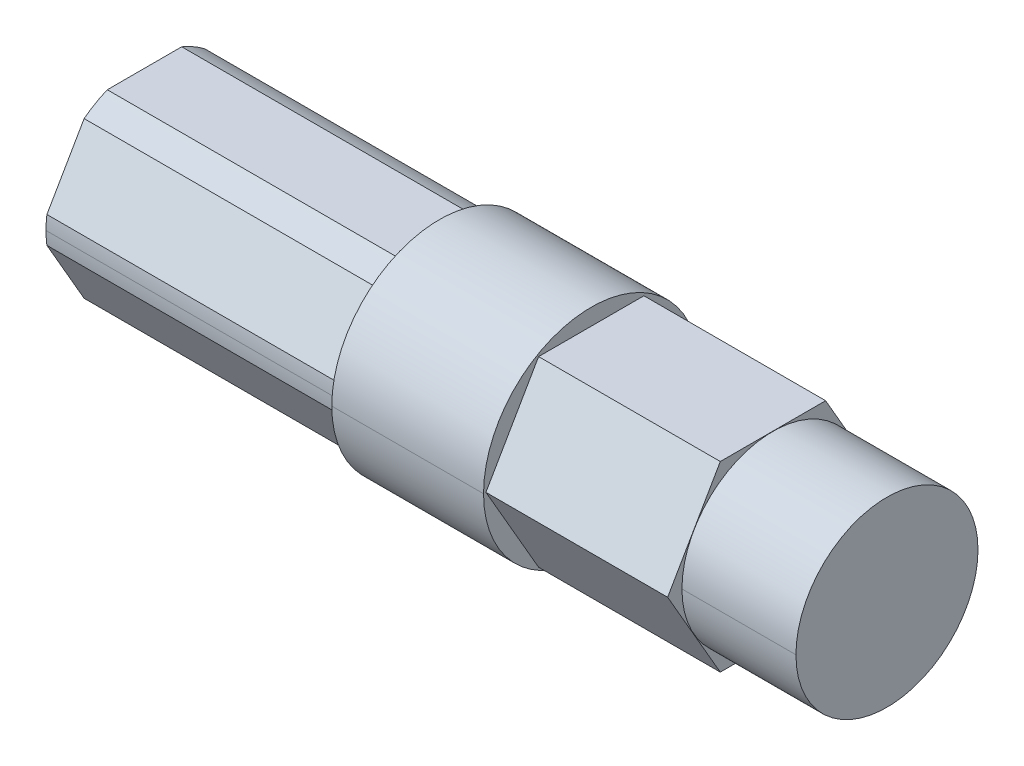
ISO-10303-21;
HEADER;
FILE_DESCRIPTION(('STEP AP214'),'2;1');
FILE_NAME('part.step','',(''),(''),'','','');
FILE_SCHEMA(('AUTOMOTIVE_DESIGN { 1 0 10303 214 1 1 1 1 }'));
ENDSEC;
DATA;
#1=APPLICATION_CONTEXT('core data for automotive mechanical design processes');
#2=APPLICATION_PROTOCOL_DEFINITION('international standard','automotive_design',2000,#1);
#3=PRODUCT_CONTEXT('',#1,'mechanical');
#4=PRODUCT('Part','Part','',(#3));
#5=PRODUCT_RELATED_PRODUCT_CATEGORY('part','',(#4));
#6=PRODUCT_DEFINITION_FORMATION('','',#4);
#7=PRODUCT_DEFINITION_CONTEXT('part definition',#1,'design');
#8=PRODUCT_DEFINITION('design','',#6,#7);
#9=PRODUCT_DEFINITION_SHAPE('','',#8);
#10=(LENGTH_UNIT() NAMED_UNIT(*) SI_UNIT(.MILLI.,.METRE.));
#11=(NAMED_UNIT(*) PLANE_ANGLE_UNIT() SI_UNIT($,.RADIAN.));
#12=(NAMED_UNIT(*) SI_UNIT($,.STERADIAN.) SOLID_ANGLE_UNIT());
#13=UNCERTAINTY_MEASURE_WITH_UNIT(LENGTH_MEASURE(1.E-05),#10,'distance_accuracy_value','');
#14=(GEOMETRIC_REPRESENTATION_CONTEXT(3) GLOBAL_UNCERTAINTY_ASSIGNED_CONTEXT((#13)) GLOBAL_UNIT_ASSIGNED_CONTEXT((#10,
#11,#12)) REPRESENTATION_CONTEXT('',''));
#15=CARTESIAN_POINT('',(0.,0.,0.));
#16=DIRECTION('',(0.,0.,1.));
#17=DIRECTION('',(1.,0.,0.));
#18=AXIS2_PLACEMENT_3D('',#15,#16,#17);
#19=CARTESIAN_POINT('',(-21.8757499999997,0.,0.));
#20=DIRECTION('',(-1.,0.,0.));
#21=DIRECTION('',(0.,0.,1.));
#22=AXIS2_PLACEMENT_3D('',#19,#20,#21);
#23=CYLINDRICAL_SURFACE('',#22,2.01929999999992);
#24=DIRECTION('',(-1.,0.,0.));
#25=VECTOR('',#24,1.);
#26=CARTESIAN_POINT('',(-21.8757499999997,0.,-2.01929999999992));
#27=LINE('',#26,#25);
#28=CARTESIAN_POINT('',(-6.00074999999972,0.,-2.01929999999992));
#29=VERTEX_POINT('',#28);
#30=CARTESIAN_POINT('',(-21.8757499999997,0.,-2.0193));
#31=VERTEX_POINT('',#30);
#32=EDGE_CURVE('E372',#29,#31,#27,.T.);
#33=ORIENTED_EDGE('',*,*,#32,.F.);
#34=CARTESIAN_POINT('',(-6.00074999999972,0.,0.));
#35=DIRECTION('',(-1.,0.,0.));
#36=DIRECTION('',(0.,0.,1.));
#37=AXIS2_PLACEMENT_3D('',#34,#35,#36);
#38=CIRCLE('',#37,2.01929999999992);
#39=CARTESIAN_POINT('',(-6.00074999999972,0.,2.01929999999992));
#40=VERTEX_POINT('',#39);
#41=EDGE_CURVE('E11',#40,#29,#38,.T.);
#42=ORIENTED_EDGE('',*,*,#41,.F.);
#43=DIRECTION('',(-1.,0.,0.));
#44=VECTOR('',#43,1.);
#45=CARTESIAN_POINT('',(-21.8757499999997,0.,2.01929999999992));
#46=LINE('',#45,#44);
#47=CARTESIAN_POINT('',(-21.8757499999997,0.,2.01929999999992));
#48=VERTEX_POINT('',#47);
#49=EDGE_CURVE('E301',#40,#48,#46,.T.);
#50=ORIENTED_EDGE('',*,*,#49,.T.);
#51=CARTESIAN_POINT('',(-21.8757499999997,0.,0.));
#52=DIRECTION('',(-1.,0.,0.));
#53=DIRECTION('',(0.,0.,1.));
#54=AXIS2_PLACEMENT_3D('',#51,#52,#53);
#55=CIRCLE('',#54,2.01929999999992);
#56=EDGE_CURVE('E272',#48,#31,#55,.T.);
#57=ORIENTED_EDGE('',*,*,#56,.T.);
#58=EDGE_LOOP('',(#33,#42,#50,#57));
#59=FACE_BOUND('',#58,.T.);
#60=ADVANCED_FACE('F17',(#59),#23,.F.);
#61=CARTESIAN_POINT('',(-6.00074999999972,0.,0.));
#62=DIRECTION('',(-1.,0.,0.));
#63=DIRECTION('',(0.,0.,1.));
#64=AXIS2_PLACEMENT_3D('',#61,#62,#63);
#65=CONICAL_SURFACE('',#64,2.01929999999992,1.02974425867665);
#66=DIRECTION('',(-0.515038074910058,0.,-0.85716730070211));
#67=VECTOR('',#66,1.);
#68=CARTESIAN_POINT('',(-6.00074999999972,0.,-2.01929999999992));
#69=LINE('',#68,#67);
#70=CARTESIAN_POINT('',(-4.78743215199737,0.,0.));
#71=VERTEX_POINT('',#70);
#72=EDGE_CURVE('E350',#71,#29,#69,.T.);
#73=ORIENTED_EDGE('',*,*,#72,.F.);
#74=DIRECTION('',(-0.515038074910058,0.,0.85716730070211));
#75=VECTOR('',#74,1.);
#76=CARTESIAN_POINT('',(-6.00074999999972,0.,2.01929999999992));
#77=LINE('',#76,#75);
#78=EDGE_CURVE('E305',#71,#40,#77,.T.);
#79=ORIENTED_EDGE('',*,*,#78,.T.);
#80=ORIENTED_EDGE('',*,*,#41,.T.);
#81=EDGE_LOOP('',(#73,#79,#80));
#82=FACE_BOUND('',#81,.T.);
#83=ADVANCED_FACE('F644',(#82),#65,.F.);
#84=CARTESIAN_POINT('',(30.5440110921291,0.,0.));
#85=DIRECTION('',(-1.,0.,0.));
#86=DIRECTION('',(0.,0.,1.));
#87=AXIS2_PLACEMENT_3D('',#84,#85,#86);
#88=CYLINDRICAL_SURFACE('',#87,6.85799999999974);
#89=DIRECTION('',(1.,0.,0.));
#90=VECTOR('',#89,1.);
#91=CARTESIAN_POINT('',(30.5440110921291,-6.34999999999993,2.59030191290503));
#92=LINE('',#91,#90);
#93=CARTESIAN_POINT('',(-21.8757499999997,-6.34999999999988,2.59030191290501));
#94=VERTEX_POINT('',#93);
#95=CARTESIAN_POINT('',(-1.33985,-6.34999999999993,2.590301912905));
#96=VERTEX_POINT('',#95);
#97=EDGE_CURVE('E332',#94,#96,#92,.T.);
#98=ORIENTED_EDGE('',*,*,#97,.T.);
#99=CARTESIAN_POINT('',(-1.33985,0.,0.));
#100=DIRECTION('',(-1.,0.,0.));
#101=DIRECTION('',(0.,0.,-1.));
#102=AXIS2_PLACEMENT_3D('',#99,#100,#101);
#103=CIRCLE('',#102,6.85799999999974);
#104=CARTESIAN_POINT('',(-1.33985,-5.41826726004725,4.20411035757835));
#105=VERTEX_POINT('',#104);
#106=EDGE_CURVE('E147',#96,#105,#103,.T.);
#107=ORIENTED_EDGE('',*,*,#106,.T.);
#108=DIRECTION('',(-1.,0.,0.));
#109=VECTOR('',#108,1.);
#110=CARTESIAN_POINT('',(30.5440110921291,-5.41826726004726,4.20411035757844));
#111=LINE('',#110,#109);
#112=CARTESIAN_POINT('',(-21.8757499999997,-5.41826726004722,4.20411035757841));
#113=VERTEX_POINT('',#112);
#114=EDGE_CURVE('E328',#105,#113,#111,.T.);
#115=ORIENTED_EDGE('',*,*,#114,.T.);
#116=CARTESIAN_POINT('',(-21.8757499999997,0.,0.));
#117=DIRECTION('',(-1.,0.,0.));
#118=DIRECTION('',(0.,0.,1.));
#119=AXIS2_PLACEMENT_3D('',#116,#117,#118);
#120=CIRCLE('',#119,6.85799999999974);
#121=EDGE_CURVE('E324',#94,#113,#120,.T.);
#122=ORIENTED_EDGE('',*,*,#121,.F.);
#123=EDGE_LOOP('',(#98,#107,#115,#122));
#124=FACE_BOUND('',#123,.T.);
#125=ADVANCED_FACE('F650',(#124),#88,.T.);
#126=CARTESIAN_POINT('',(30.5440110921291,0.,0.));
#127=DIRECTION('',(-1.,0.,0.));
#128=DIRECTION('',(0.,0.,1.));
#129=AXIS2_PLACEMENT_3D('',#126,#127,#128);
#130=CYLINDRICAL_SURFACE('',#129,6.85799999999974);
#131=DIRECTION('',(-1.,0.,0.));
#132=VECTOR('',#131,1.);
#133=CARTESIAN_POINT('',(30.5440110921291,0.,6.85799999999974));
#134=LINE('',#133,#132);
#135=CARTESIAN_POINT('',(-1.33985,0.,6.858));
#136=VERTEX_POINT('',#135);
#137=CARTESIAN_POINT('',(-21.8757499999997,0.,6.858));
#138=VERTEX_POINT('',#137);
#139=EDGE_CURVE('E504',#136,#138,#134,.T.);
#140=ORIENTED_EDGE('',*,*,#139,.F.);
#141=CARTESIAN_POINT('',(-1.33985,0.,0.));
#142=DIRECTION('',(-1.,0.,0.));
#143=DIRECTION('',(0.,1.93484117616543E-13,-1.));
#144=AXIS2_PLACEMENT_3D('',#141,#142,#143);
#145=CIRCLE('',#144,6.85799999999974);
#146=CARTESIAN_POINT('',(-1.33985,0.93173273995268,6.79441227048352));
#147=VERTEX_POINT('',#146);
#148=EDGE_CURVE('E385',#136,#147,#145,.T.);
#149=ORIENTED_EDGE('',*,*,#148,.T.);
#150=DIRECTION('',(-1.,0.,0.));
#151=VECTOR('',#150,1.);
#152=CARTESIAN_POINT('',(30.5440110921291,0.931732739952683,6.79441227048351));
#153=LINE('',#152,#151);
#154=CARTESIAN_POINT('',(-21.8757499999997,0.931732739952685,6.79441227048351));
#155=VERTEX_POINT('',#154);
#156=EDGE_CURVE('E357',#147,#155,#153,.T.);
#157=ORIENTED_EDGE('',*,*,#156,.T.);
#158=CARTESIAN_POINT('',(-21.8757499999997,0.,0.));
#159=DIRECTION('',(-1.,0.,0.));
#160=DIRECTION('',(0.,0.,1.));
#161=AXIS2_PLACEMENT_3D('',#158,#159,#160);
#162=CIRCLE('',#161,6.85799999999974);
#163=EDGE_CURVE('E296',#138,#155,#162,.T.);
#164=ORIENTED_EDGE('',*,*,#163,.F.);
#165=EDGE_LOOP('',(#140,#149,#157,#164));
#166=FACE_BOUND('',#165,.T.);
#167=ADVANCED_FACE('F574',(#166),#130,.T.);
#168=CARTESIAN_POINT('',(30.5440110921291,0.,0.));
#169=DIRECTION('',(-1.,0.,0.));
#170=DIRECTION('',(0.,0.,1.));
#171=AXIS2_PLACEMENT_3D('',#168,#169,#170);
#172=CYLINDRICAL_SURFACE('',#171,6.85799999999974);
#173=DIRECTION('',(1.,0.,0.));
#174=VECTOR('',#173,1.);
#175=CARTESIAN_POINT('',(30.5440110921291,5.41826726004728,4.20411035757846));
#176=LINE('',#175,#174);
#177=CARTESIAN_POINT('',(-21.8757499999997,5.41826726004728,4.20411035757846));
#178=VERTEX_POINT('',#177);
#179=CARTESIAN_POINT('',(-1.33985,5.41826726004728,4.20411035757842));
#180=VERTEX_POINT('',#179);
#181=EDGE_CURVE('E403',#178,#180,#176,.T.);
#182=ORIENTED_EDGE('',*,*,#181,.T.);
#183=CARTESIAN_POINT('',(-1.33985,0.,0.));
#184=DIRECTION('',(-1.,0.,0.));
#185=DIRECTION('',(0.,-1.68892677621096E-13,-1.));
#186=AXIS2_PLACEMENT_3D('',#183,#184,#185);
#187=CIRCLE('',#186,6.85799999999974);
#188=CARTESIAN_POINT('',(-1.33985,6.35,2.59030191290503));
#189=VERTEX_POINT('',#188);
#190=EDGE_CURVE('E370',#180,#189,#187,.T.);
#191=ORIENTED_EDGE('',*,*,#190,.T.);
#192=DIRECTION('',(-1.,0.,0.));
#193=VECTOR('',#192,1.);
#194=CARTESIAN_POINT('',(30.5440110921291,6.35,2.59030191290505));
#195=LINE('',#194,#193);
#196=CARTESIAN_POINT('',(-21.8757499999997,6.35,2.59030191290503));
#197=VERTEX_POINT('',#196);
#198=EDGE_CURVE('E400',#189,#197,#195,.T.);
#199=ORIENTED_EDGE('',*,*,#198,.T.);
#200=CARTESIAN_POINT('',(-21.8757499999997,0.,0.));
#201=DIRECTION('',(-1.,0.,0.));
#202=DIRECTION('',(0.,0.,1.));
#203=AXIS2_PLACEMENT_3D('',#200,#201,#202);
#204=CIRCLE('',#203,6.85799999999974);
#205=EDGE_CURVE('E270',#178,#197,#204,.T.);
#206=ORIENTED_EDGE('',*,*,#205,.F.);
#207=EDGE_LOOP('',(#182,#191,#199,#206));
#208=FACE_BOUND('',#207,.T.);
#209=ADVANCED_FACE('F569',(#208),#172,.T.);
#210=CARTESIAN_POINT('',(30.5440110921291,0.,0.));
#211=DIRECTION('',(-1.,0.,0.));
#212=DIRECTION('',(0.,0.,1.));
#213=AXIS2_PLACEMENT_3D('',#210,#211,#212);
#214=CYLINDRICAL_SURFACE('',#213,6.85799999999974);
#215=DIRECTION('',(1.,0.,0.));
#216=VECTOR('',#215,1.);
#217=CARTESIAN_POINT('',(30.5440110921291,6.3499999999999,-2.59030191290502));
#218=LINE('',#217,#216);
#219=CARTESIAN_POINT('',(-21.8757499999997,6.35,-2.59030191290502));
#220=VERTEX_POINT('',#219);
#221=CARTESIAN_POINT('',(-1.33985,6.34999999999992,-2.59030191290504));
#222=VERTEX_POINT('',#221);
#223=EDGE_CURVE('E250',#220,#222,#218,.T.);
#224=ORIENTED_EDGE('',*,*,#223,.T.);
#225=CARTESIAN_POINT('',(-1.33985,0.,0.));
#226=DIRECTION('',(-1.,0.,0.));
#227=DIRECTION('',(0.,-1.33365540833093E-13,-1.));
#228=AXIS2_PLACEMENT_3D('',#225,#226,#227);
#229=CIRCLE('',#228,6.85799999999974);
#230=CARTESIAN_POINT('',(-1.33985,5.41826726004726,-4.20411035757847));
#231=VERTEX_POINT('',#230);
#232=EDGE_CURVE('E367',#222,#231,#229,.T.);
#233=ORIENTED_EDGE('',*,*,#232,.T.);
#234=DIRECTION('',(-1.,0.,0.));
#235=VECTOR('',#234,1.);
#236=CARTESIAN_POINT('',(30.5440110921291,5.41826726004725,-4.20411035757838));
#237=LINE('',#236,#235);
#238=CARTESIAN_POINT('',(-21.8757499999997,5.41826726004728,-4.20411035757841));
#239=VERTEX_POINT('',#238);
#240=EDGE_CURVE('E261',#231,#239,#237,.T.);
#241=ORIENTED_EDGE('',*,*,#240,.T.);
#242=CARTESIAN_POINT('',(-21.8757499999997,0.,0.));
#243=DIRECTION('',(-1.,0.,0.));
#244=DIRECTION('',(0.,0.,1.));
#245=AXIS2_PLACEMENT_3D('',#242,#243,#244);
#246=CIRCLE('',#245,6.85799999999974);
#247=EDGE_CURVE('E267',#220,#239,#246,.T.);
#248=ORIENTED_EDGE('',*,*,#247,.F.);
#249=EDGE_LOOP('',(#224,#233,#241,#248));
#250=FACE_BOUND('',#249,.T.);
#251=ADVANCED_FACE('F274',(#250),#214,.T.);
#252=CARTESIAN_POINT('',(30.5440110921291,0.,0.));
#253=DIRECTION('',(-1.,0.,0.));
#254=DIRECTION('',(0.,0.,1.));
#255=AXIS2_PLACEMENT_3D('',#252,#253,#254);
#256=CYLINDRICAL_SURFACE('',#255,6.85799999999974);
#257=DIRECTION('',(-1.,0.,0.));
#258=VECTOR('',#257,1.);
#259=CARTESIAN_POINT('',(30.5440110921291,-6.35,-2.59030191290498));
#260=LINE('',#259,#258);
#261=CARTESIAN_POINT('',(-1.33985,-6.35,-2.590301912905));
#262=VERTEX_POINT('',#261);
#263=CARTESIAN_POINT('',(-21.8757499999997,-6.34999999999992,-2.590301912905));
#264=VERTEX_POINT('',#263);
#265=EDGE_CURVE('E389',#262,#264,#260,.T.);
#266=ORIENTED_EDGE('',*,*,#265,.T.);
#267=CARTESIAN_POINT('',(-21.8757499999997,0.,0.));
#268=DIRECTION('',(-1.,0.,0.));
#269=DIRECTION('',(0.,0.,1.));
#270=AXIS2_PLACEMENT_3D('',#267,#268,#269);
#271=CIRCLE('',#270,6.85799999999974);
#272=CARTESIAN_POINT('',(-21.8757499999997,-5.41826726004726,-4.20411035757834));
#273=VERTEX_POINT('',#272);
#274=EDGE_CURVE('E406',#273,#264,#271,.T.);
#275=ORIENTED_EDGE('',*,*,#274,.F.);
#276=DIRECTION('',(1.,0.,0.));
#277=VECTOR('',#276,1.);
#278=CARTESIAN_POINT('',(30.5440110921291,-5.41826726004728,-4.20411035757838));
#279=LINE('',#278,#277);
#280=CARTESIAN_POINT('',(-1.33985,-5.41826726004728,-4.20411035757838));
#281=VERTEX_POINT('',#280);
#282=EDGE_CURVE('E311',#273,#281,#279,.T.);
#283=ORIENTED_EDGE('',*,*,#282,.T.);
#284=CARTESIAN_POINT('',(-1.33985,0.,0.));
#285=DIRECTION('',(-1.,0.,0.));
#286=DIRECTION('',(0.,0.,-1.));
#287=AXIS2_PLACEMENT_3D('',#284,#285,#286);
#288=CIRCLE('',#287,6.85799999999974);
#289=EDGE_CURVE('E137',#281,#262,#288,.T.);
#290=ORIENTED_EDGE('',*,*,#289,.T.);
#291=EDGE_LOOP('',(#266,#275,#283,#290));
#292=FACE_BOUND('',#291,.T.);
#293=ADVANCED_FACE('F926',(#292),#256,.T.);
#294=CARTESIAN_POINT('',(30.5440110921291,0.,0.));
#295=DIRECTION('',(-1.,0.,0.));
#296=DIRECTION('',(0.,0.,1.));
#297=AXIS2_PLACEMENT_3D('',#294,#295,#296);
#298=CYLINDRICAL_SURFACE('',#297,6.85799999999974);
#299=DIRECTION('',(1.,0.,0.));
#300=VECTOR('',#299,1.);
#301=CARTESIAN_POINT('',(30.5440110921291,0.931732739952728,-6.79441227048341));
#302=LINE('',#301,#300);
#303=CARTESIAN_POINT('',(-21.8757499999997,0.931732739952731,-6.79441227048341));
#304=VERTEX_POINT('',#303);
#305=CARTESIAN_POINT('',(-1.33985,0.931732739952723,-6.79441227048351));
#306=VERTEX_POINT('',#305);
#307=EDGE_CURVE('E362',#304,#306,#302,.T.);
#308=ORIENTED_EDGE('',*,*,#307,.T.);
#309=CARTESIAN_POINT('',(-1.33985,0.,0.));
#310=DIRECTION('',(-1.,0.,0.));
#311=DIRECTION('',(0.,3.69343444717162E-13,-1.));
#312=AXIS2_PLACEMENT_3D('',#309,#310,#311);
#313=CIRCLE('',#312,6.85799999999974);
#314=CARTESIAN_POINT('',(-1.33985,-0.931732739952709,-6.79441227048352));
#315=VERTEX_POINT('',#314);
#316=EDGE_CURVE('E371',#306,#315,#313,.T.);
#317=ORIENTED_EDGE('',*,*,#316,.T.);
#318=DIRECTION('',(-1.,0.,0.));
#319=VECTOR('',#318,1.);
#320=CARTESIAN_POINT('',(30.5440110921291,-0.931732739952695,-6.79441227048342));
#321=LINE('',#320,#319);
#322=CARTESIAN_POINT('',(-21.8757499999997,-0.931732739952699,-6.79441227048345));
#323=VERTEX_POINT('',#322);
#324=EDGE_CURVE('E312',#315,#323,#321,.T.);
#325=ORIENTED_EDGE('',*,*,#324,.T.);
#326=CARTESIAN_POINT('',(-21.8757499999997,0.,0.));
#327=DIRECTION('',(-1.,0.,0.));
#328=DIRECTION('',(0.,0.,1.));
#329=AXIS2_PLACEMENT_3D('',#326,#327,#328);
#330=CIRCLE('',#329,6.85799999999974);
#331=EDGE_CURVE('E286',#304,#323,#330,.T.);
#332=ORIENTED_EDGE('',*,*,#331,.F.);
#333=EDGE_LOOP('',(#308,#317,#325,#332));
#334=FACE_BOUND('',#333,.T.);
#335=ADVANCED_FACE('F426',(#334),#298,.T.);
#336=CARTESIAN_POINT('',(-1.33985,0.,0.));
#337=DIRECTION('',(1.,0.,0.));
#338=DIRECTION('',(0.,0.,-1.));
#339=AXIS2_PLACEMENT_3D('',#336,#337,#338);
#340=CYLINDRICAL_SURFACE('',#339,7.49999999999972);
#341=DIRECTION('',(1.,0.,0.));
#342=VECTOR('',#341,1.);
#343=CARTESIAN_POINT('',(-1.33985,0.,7.49999999999972));
#344=LINE('',#343,#342);
#345=CARTESIAN_POINT('',(-1.33985,0.,7.5));
#346=VERTEX_POINT('',#345);
#347=CARTESIAN_POINT('',(9.22654999999914,0.,7.5));
#348=VERTEX_POINT('',#347);
#349=EDGE_CURVE('E337',#346,#348,#344,.T.);
#350=ORIENTED_EDGE('',*,*,#349,.F.);
#351=CARTESIAN_POINT('',(-1.33985,0.,0.));
#352=DIRECTION('',(1.,0.,0.));
#353=DIRECTION('',(0.,0.,-1.));
#354=AXIS2_PLACEMENT_3D('',#351,#352,#353);
#355=CIRCLE('',#354,7.49999999999972);
#356=CARTESIAN_POINT('',(-1.33985,0.,-7.49999999999972));
#357=VERTEX_POINT('',#356);
#358=EDGE_CURVE('E363',#346,#357,#355,.T.);
#359=ORIENTED_EDGE('',*,*,#358,.T.);
#360=DIRECTION('',(1.,0.,0.));
#361=VECTOR('',#360,1.);
#362=CARTESIAN_POINT('',(-1.33985,0.,-7.49999999999972));
#363=LINE('',#362,#361);
#364=CARTESIAN_POINT('',(9.22654999999914,0.,-7.49999999999972));
#365=VERTEX_POINT('',#364);
#366=EDGE_CURVE('E336',#357,#365,#363,.T.);
#367=ORIENTED_EDGE('',*,*,#366,.T.);
#368=CARTESIAN_POINT('',(9.22654999999914,0.,0.));
#369=DIRECTION('',(1.,0.,0.));
#370=DIRECTION('',(0.,0.,-1.));
#371=AXIS2_PLACEMENT_3D('',#368,#369,#370);
#372=CIRCLE('',#371,7.49999999999972);
#373=EDGE_CURVE('E27',#348,#365,#372,.T.);
#374=ORIENTED_EDGE('',*,*,#373,.F.);
#375=EDGE_LOOP('',(#350,#359,#367,#374));
#376=FACE_BOUND('',#375,.T.);
#377=ADVANCED_FACE('F629',(#376),#340,.T.);
#378=CARTESIAN_POINT('',(9.22654999999914,0.,0.));
#379=DIRECTION('',(1.,0.,0.));
#380=DIRECTION('',(0.,0.,1.));
#381=AXIS2_PLACEMENT_3D('',#378,#379,#380);
#382=PLANE('',#381);
#383=DIRECTION('',(0.,0.866025403784443,-0.499999999999992));
#384=VECTOR('',#383,1.);
#385=CARTESIAN_POINT('',(9.22654999999914,-6.34999999999988,-3.66617420935398));
#386=LINE('',#385,#384);
#387=CARTESIAN_POINT('',(9.22654999999914,-6.34999999999988,-3.66617420935398));
#388=VERTEX_POINT('',#387);
#389=CARTESIAN_POINT('',(9.22654999999914,0.,-7.33234841870786));
#390=VERTEX_POINT('',#389);
#391=EDGE_CURVE('E461',#388,#390,#386,.T.);
#392=ORIENTED_EDGE('',*,*,#391,.F.);
#393=DIRECTION('',(0.,0.,-1.));
#394=VECTOR('',#393,1.);
#395=CARTESIAN_POINT('',(9.22654999999914,-6.34999999999992,3.66617420935392));
#396=LINE('',#395,#394);
#397=CARTESIAN_POINT('',(9.22654999999914,-6.34999999999992,3.66617420935392));
#398=VERTEX_POINT('',#397);
#399=EDGE_CURVE('E322',#398,#388,#396,.T.);
#400=ORIENTED_EDGE('',*,*,#399,.F.);
#401=DIRECTION('',(0.,-0.866025403784446,-0.499999999999988));
#402=VECTOR('',#401,1.);
#403=CARTESIAN_POINT('',(9.22654999999914,0.,7.33234841870792));
#404=LINE('',#403,#402);
#405=CARTESIAN_POINT('',(9.22654999999914,0.,7.33234841870792));
#406=VERTEX_POINT('',#405);
#407=EDGE_CURVE('E405',#406,#398,#404,.T.);
#408=ORIENTED_EDGE('',*,*,#407,.F.);
#409=DIRECTION('',(0.,-0.866025403784443,0.499999999999992));
#410=VECTOR('',#409,1.);
#411=CARTESIAN_POINT('',(9.22654999999914,6.35,3.66617420935392));
#412=LINE('',#411,#410);
#413=CARTESIAN_POINT('',(9.22654999999914,6.35,3.66617420935392));
#414=VERTEX_POINT('',#413);
#415=EDGE_CURVE('E446',#414,#406,#412,.T.);
#416=ORIENTED_EDGE('',*,*,#415,.F.);
#417=DIRECTION('',(0.,0.,1.));
#418=VECTOR('',#417,1.);
#419=CARTESIAN_POINT('',(9.22654999999914,6.35,-3.66617420935401));
#420=LINE('',#419,#418);
#421=CARTESIAN_POINT('',(9.22654999999914,6.35,-3.66617420935401));
#422=VERTEX_POINT('',#421);
#423=EDGE_CURVE('E313',#422,#414,#420,.T.);
#424=ORIENTED_EDGE('',*,*,#423,.F.);
#425=DIRECTION('',(0.,0.866025403784446,0.499999999999987));
#426=VECTOR('',#425,1.);
#427=CARTESIAN_POINT('',(9.22654999999914,0.,-7.33234841870786));
#428=LINE('',#427,#426);
#429=EDGE_CURVE('E348',#390,#422,#428,.T.);
#430=ORIENTED_EDGE('',*,*,#429,.F.);
#431=EDGE_LOOP('',(#392,#400,#408,#416,#424,#430));
#432=FACE_BOUND('',#431,.T.);
#433=CARTESIAN_POINT('',(9.22654999999914,0.,0.));
#434=DIRECTION('',(1.,0.,0.));
#435=DIRECTION('',(0.,0.,-1.));
#436=AXIS2_PLACEMENT_3D('',#433,#434,#435);
#437=CIRCLE('',#436,7.49999999999972);
#438=EDGE_CURVE('E333',#365,#348,#437,.T.);
#439=ORIENTED_EDGE('',*,*,#438,.T.);
#440=ORIENTED_EDGE('',*,*,#373,.T.);
#441=EDGE_LOOP('',(#439,#440));
#442=FACE_BOUND('',#441,.T.);
#443=ADVANCED_FACE('F533',(#432,#442),#382,.T.);
#444=CARTESIAN_POINT('',(-1.33985,0.,0.));
#445=DIRECTION('',(1.,0.,0.));
#446=DIRECTION('',(0.,0.,1.));
#447=AXIS2_PLACEMENT_3D('',#444,#445,#446);
#448=PLANE('',#447);
#449=ORIENTED_EDGE('',*,*,#106,.F.);
#450=DIRECTION('',(0.,0.,-1.));
#451=VECTOR('',#450,1.);
#452=CARTESIAN_POINT('',(-1.33985,-6.35,3.66617420935395));
#453=LINE('',#452,#451);
#454=EDGE_CURVE('E392',#96,#262,#453,.T.);
#455=ORIENTED_EDGE('',*,*,#454,.T.);
#456=ORIENTED_EDGE('',*,*,#289,.F.);
#457=DIRECTION('',(0.,0.866025403784443,-0.499999999999992));
#458=VECTOR('',#457,1.);
#459=CARTESIAN_POINT('',(-1.33985,-6.34999999999992,-3.66617420935395));
#460=LINE('',#459,#458);
#461=EDGE_CURVE('E307',#281,#315,#460,.T.);
#462=ORIENTED_EDGE('',*,*,#461,.T.);
#463=ORIENTED_EDGE('',*,*,#316,.F.);
#464=DIRECTION('',(0.,0.866025403784446,0.499999999999987));
#465=VECTOR('',#464,1.);
#466=CARTESIAN_POINT('',(-1.33985,0.,-7.33234841870794));
#467=LINE('',#466,#465);
#468=EDGE_CURVE('E358',#306,#231,#467,.T.);
#469=ORIENTED_EDGE('',*,*,#468,.T.);
#470=ORIENTED_EDGE('',*,*,#232,.F.);
#471=DIRECTION('',(0.,0.,1.));
#472=VECTOR('',#471,1.);
#473=CARTESIAN_POINT('',(-1.33985,6.35,-3.66617420935397));
#474=LINE('',#473,#472);
#475=EDGE_CURVE('E257',#222,#189,#474,.T.);
#476=ORIENTED_EDGE('',*,*,#475,.T.);
#477=ORIENTED_EDGE('',*,*,#190,.F.);
#478=DIRECTION('',(0.,-0.866025403784443,0.499999999999992));
#479=VECTOR('',#478,1.);
#480=CARTESIAN_POINT('',(-1.33985,6.34999999999989,3.66617420935395));
#481=LINE('',#480,#479);
#482=EDGE_CURVE('E566',#180,#147,#481,.T.);
#483=ORIENTED_EDGE('',*,*,#482,.T.);
#484=ORIENTED_EDGE('',*,*,#148,.F.);
#485=CARTESIAN_POINT('',(-1.33985,0.,0.));
#486=DIRECTION('',(-1.,0.,0.));
#487=DIRECTION('',(0.,1.94372296036244E-13,-1.));
#488=AXIS2_PLACEMENT_3D('',#485,#486,#487);
#489=CIRCLE('',#488,6.85799999999974);
#490=CARTESIAN_POINT('',(-1.33985,-0.931732739952692,6.79441227048352));
#491=VERTEX_POINT('',#490);
#492=EDGE_CURVE('E354',#491,#136,#489,.T.);
#493=ORIENTED_EDGE('',*,*,#492,.F.);
#494=DIRECTION('',(0.,-0.866025403784446,-0.499999999999988));
#495=VECTOR('',#494,1.);
#496=CARTESIAN_POINT('',(-1.33985,0.,7.33234841870791));
#497=LINE('',#496,#495);
#498=EDGE_CURVE('E331',#491,#105,#497,.T.);
#499=ORIENTED_EDGE('',*,*,#498,.T.);
#500=EDGE_LOOP('',(#449,#455,#456,#462,#463,#469,#470,#476,#477,#483,#484,#493,#499));
#501=FACE_BOUND('',#500,.T.);
#502=CARTESIAN_POINT('',(-1.33985,0.,0.));
#503=DIRECTION('',(1.,0.,0.));
#504=DIRECTION('',(0.,0.,-1.));
#505=AXIS2_PLACEMENT_3D('',#502,#503,#504);
#506=CIRCLE('',#505,7.49999999999972);
#507=EDGE_CURVE('E438',#357,#346,#506,.T.);
#508=ORIENTED_EDGE('',*,*,#507,.F.);
#509=ORIENTED_EDGE('',*,*,#358,.F.);
#510=EDGE_LOOP('',(#508,#509));
#511=FACE_BOUND('',#510,.T.);
#512=ADVANCED_FACE('F631',(#501,#511),#448,.F.);
#513=CARTESIAN_POINT('',(29.8132499999987,0.,0.));
#514=DIRECTION('',(1.,0.,0.));
#515=DIRECTION('',(0.,0.,1.));
#516=AXIS2_PLACEMENT_3D('',#513,#514,#515);
#517=PLANE('',#516);
#518=CARTESIAN_POINT('',(29.8132499999987,0.,0.));
#519=DIRECTION('',(1.,0.,0.));
#520=DIRECTION('',(0.,0.,-1.));
#521=AXIS2_PLACEMENT_3D('',#518,#519,#520);
#522=CIRCLE('',#521,6.33729999999976);
#523=CARTESIAN_POINT('',(29.8132499999987,0.,6.3373));
#524=VERTEX_POINT('',#523);
#525=CARTESIAN_POINT('',(29.8132499999987,0.,-6.3373));
#526=VERTEX_POINT('',#525);
#527=EDGE_CURVE('E108',#524,#526,#522,.T.);
#528=ORIENTED_EDGE('',*,*,#527,.T.);
#529=CARTESIAN_POINT('',(29.8132499999987,0.,0.));
#530=DIRECTION('',(1.,0.,0.));
#531=DIRECTION('',(0.,0.,-1.));
#532=AXIS2_PLACEMENT_3D('',#529,#530,#531);
#533=CIRCLE('',#532,6.33729999999976);
#534=EDGE_CURVE('E379',#526,#524,#533,.T.);
#535=ORIENTED_EDGE('',*,*,#534,.T.);
#536=EDGE_LOOP('',(#528,#535));
#537=FACE_BOUND('',#536,.T.);
#538=ADVANCED_FACE('F588',(#537),#517,.T.);
#539=CARTESIAN_POINT('',(29.8132499999987,0.,0.));
#540=DIRECTION('',(-1.,0.,0.));
#541=DIRECTION('',(0.,0.,1.));
#542=AXIS2_PLACEMENT_3D('',#539,#540,#541);
#543=CYLINDRICAL_SURFACE('',#542,6.33729999999976);
#544=DIRECTION('',(-1.,0.,0.));
#545=VECTOR('',#544,1.);
#546=CARTESIAN_POINT('',(29.8132499999987,0.,-6.33729999999976));
#547=LINE('',#546,#545);
#548=CARTESIAN_POINT('',(21.8757499999992,0.,-6.3373));
#549=VERTEX_POINT('',#548);
#550=EDGE_CURVE('E393',#526,#549,#547,.T.);
#551=ORIENTED_EDGE('',*,*,#550,.F.);
#552=ORIENTED_EDGE('',*,*,#527,.F.);
#553=DIRECTION('',(-1.,0.,0.));
#554=VECTOR('',#553,1.);
#555=CARTESIAN_POINT('',(29.8132499999987,0.,6.33729999999976));
#556=LINE('',#555,#554);
#557=CARTESIAN_POINT('',(21.8757499999992,0.,6.3373));
#558=VERTEX_POINT('',#557);
#559=EDGE_CURVE('E279',#524,#558,#556,.T.);
#560=ORIENTED_EDGE('',*,*,#559,.T.);
#561=CARTESIAN_POINT('',(21.8757499999992,0.,0.));
#562=DIRECTION('',(1.,0.,0.));
#563=DIRECTION('',(0.,0.,-1.));
#564=AXIS2_PLACEMENT_3D('',#561,#562,#563);
#565=CIRCLE('',#564,6.33729999999976);
#566=EDGE_CURVE('E475',#558,#549,#565,.T.);
#567=ORIENTED_EDGE('',*,*,#566,.T.);
#568=EDGE_LOOP('',(#551,#552,#560,#567));
#569=FACE_BOUND('',#568,.T.);
#570=ADVANCED_FACE('F594',(#569),#543,.T.);
#571=CARTESIAN_POINT('',(21.8757499999992,0.,0.));
#572=DIRECTION('',(1.,0.,0.));
#573=DIRECTION('',(0.,0.,1.));
#574=AXIS2_PLACEMENT_3D('',#571,#572,#573);
#575=PLANE('',#574);
#576=ORIENTED_EDGE('',*,*,#566,.F.);
#577=CARTESIAN_POINT('',(21.8757499999992,0.,0.));
#578=DIRECTION('',(1.,0.,0.));
#579=DIRECTION('',(0.,0.,-1.));
#580=AXIS2_PLACEMENT_3D('',#577,#578,#579);
#581=CIRCLE('',#580,6.33729999999976);
#582=EDGE_CURVE('E290',#549,#558,#581,.T.);
#583=ORIENTED_EDGE('',*,*,#582,.F.);
#584=EDGE_LOOP('',(#576,#583));
#585=FACE_BOUND('',#584,.T.);
#586=DIRECTION('',(0.,0.866025403784443,-0.499999999999992));
#587=VECTOR('',#586,1.);
#588=CARTESIAN_POINT('',(21.8757499999992,-6.35,-3.66617420935397));
#589=LINE('',#588,#587);
#590=CARTESIAN_POINT('',(21.8757499999992,-6.35,-3.66617420935397));
#591=VERTEX_POINT('',#590);
#592=CARTESIAN_POINT('',(21.8757499999992,0.,-7.33234841870789));
#593=VERTEX_POINT('',#592);
#594=EDGE_CURVE('E344',#591,#593,#589,.T.);
#595=ORIENTED_EDGE('',*,*,#594,.T.);
#596=DIRECTION('',(0.,0.866025403784446,0.499999999999987));
#597=VECTOR('',#596,1.);
#598=CARTESIAN_POINT('',(21.8757499999992,0.,-7.33234841870789));
#599=LINE('',#598,#597);
#600=CARTESIAN_POINT('',(21.8757499999992,6.34999999999988,-3.66617420935399));
#601=VERTEX_POINT('',#600);
#602=EDGE_CURVE('E318',#593,#601,#599,.T.);
#603=ORIENTED_EDGE('',*,*,#602,.T.);
#604=DIRECTION('',(0.,0.,1.));
#605=VECTOR('',#604,1.);
#606=CARTESIAN_POINT('',(21.8757499999992,6.34999999999988,-3.66617420935399));
#607=LINE('',#606,#605);
#608=CARTESIAN_POINT('',(21.8757499999992,6.34999999999984,3.66617420935394));
#609=VERTEX_POINT('',#608);
#610=EDGE_CURVE('E451',#601,#609,#607,.T.);
#611=ORIENTED_EDGE('',*,*,#610,.T.);
#612=DIRECTION('',(0.,-0.866025403784443,0.499999999999992));
#613=VECTOR('',#612,1.);
#614=CARTESIAN_POINT('',(21.8757499999992,6.34999999999984,3.66617420935394));
#615=LINE('',#614,#613);
#616=CARTESIAN_POINT('',(21.8757499999992,0.,7.33234841870796));
#617=VERTEX_POINT('',#616);
#618=EDGE_CURVE('E455',#609,#617,#615,.T.);
#619=ORIENTED_EDGE('',*,*,#618,.T.);
#620=DIRECTION('',(0.,-0.866025403784446,-0.499999999999988));
#621=VECTOR('',#620,1.);
#622=CARTESIAN_POINT('',(21.8757499999992,0.,7.33234841870796));
#623=LINE('',#622,#621);
#624=CARTESIAN_POINT('',(21.8757499999992,-6.35,3.66617420935393));
#625=VERTEX_POINT('',#624);
#626=EDGE_CURVE('E319',#617,#625,#623,.T.);
#627=ORIENTED_EDGE('',*,*,#626,.T.);
#628=DIRECTION('',(0.,0.,-1.));
#629=VECTOR('',#628,1.);
#630=CARTESIAN_POINT('',(21.8757499999992,-6.35,3.66617420935393));
#631=LINE('',#630,#629);
#632=EDGE_CURVE('E42',#625,#591,#631,.T.);
#633=ORIENTED_EDGE('',*,*,#632,.T.);
#634=EDGE_LOOP('',(#595,#603,#611,#619,#627,#633));
#635=FACE_BOUND('',#634,.T.);
#636=ADVANCED_FACE('F598',(#585,#635),#575,.T.);
#637=CARTESIAN_POINT('',(21.8757499999992,-6.35,3.66617420935393));
#638=DIRECTION('',(0.,1.,0.));
#639=DIRECTION('',(0.,0.,-1.));
#640=AXIS2_PLACEMENT_3D('',#637,#638,#639);
#641=PLANE('',#640);
#642=DIRECTION('',(-1.,0.,0.));
#643=VECTOR('',#642,1.);
#644=CARTESIAN_POINT('',(21.8757499999992,-6.35,3.66617420935393));
#645=LINE('',#644,#643);
#646=EDGE_CURVE('E323',#625,#398,#645,.T.);
#647=ORIENTED_EDGE('',*,*,#646,.T.);
#648=ORIENTED_EDGE('',*,*,#399,.T.);
#649=DIRECTION('',(-1.,0.,0.));
#650=VECTOR('',#649,1.);
#651=CARTESIAN_POINT('',(21.8757499999992,-6.35,-3.66617420935397));
#652=LINE('',#651,#650);
#653=EDGE_CURVE('E514',#591,#388,#652,.T.);
#654=ORIENTED_EDGE('',*,*,#653,.F.);
#655=ORIENTED_EDGE('',*,*,#632,.F.);
#656=EDGE_LOOP('',(#647,#648,#654,#655));
#657=FACE_BOUND('',#656,.T.);
#658=ADVANCED_FACE('F601',(#657),#641,.F.);
#659=CARTESIAN_POINT('',(21.8757499999992,0.,7.33234841870796));
#660=DIRECTION('',(0.,0.499999999999988,-0.866025403784446));
#661=DIRECTION('',(-1.,0.,0.));
#662=AXIS2_PLACEMENT_3D('',#659,#660,#661);
#663=PLANE('',#662);
#664=DIRECTION('',(-1.,0.,0.));
#665=VECTOR('',#664,1.);
#666=CARTESIAN_POINT('',(21.8757499999992,0.,7.33234841870796));
#667=LINE('',#666,#665);
#668=EDGE_CURVE('E450',#617,#406,#667,.T.);
#669=ORIENTED_EDGE('',*,*,#668,.T.);
#670=ORIENTED_EDGE('',*,*,#407,.T.);
#671=ORIENTED_EDGE('',*,*,#646,.F.);
#672=ORIENTED_EDGE('',*,*,#626,.F.);
#673=EDGE_LOOP('',(#669,#670,#671,#672));
#674=FACE_BOUND('',#673,.T.);
#675=ADVANCED_FACE('F608',(#674),#663,.F.);
#676=CARTESIAN_POINT('',(21.8757499999992,6.34999999999984,3.66617420935394));
#677=DIRECTION('',(0.,-0.499999999999992,-0.866025403784443));
#678=DIRECTION('',(0.,-0.866025403784443,0.499999999999992));
#679=AXIS2_PLACEMENT_3D('',#676,#677,#678);
#680=PLANE('',#679);
#681=DIRECTION('',(-1.,0.,0.));
#682=VECTOR('',#681,1.);
#683=CARTESIAN_POINT('',(21.8757499999992,6.34999999999984,3.66617420935394));
#684=LINE('',#683,#682);
#685=EDGE_CURVE('E317',#609,#414,#684,.T.);
#686=ORIENTED_EDGE('',*,*,#685,.T.);
#687=ORIENTED_EDGE('',*,*,#415,.T.);
#688=ORIENTED_EDGE('',*,*,#668,.F.);
#689=ORIENTED_EDGE('',*,*,#618,.F.);
#690=EDGE_LOOP('',(#686,#687,#688,#689));
#691=FACE_BOUND('',#690,.T.);
#692=ADVANCED_FACE('F609',(#691),#680,.F.);
#693=CARTESIAN_POINT('',(21.8757499999992,6.34999999999988,-3.66617420935399));
#694=DIRECTION('',(0.,-1.,0.));
#695=DIRECTION('',(0.,0.,-1.));
#696=AXIS2_PLACEMENT_3D('',#693,#694,#695);
#697=PLANE('',#696);
#698=DIRECTION('',(-1.,0.,0.));
#699=VECTOR('',#698,1.);
#700=CARTESIAN_POINT('',(21.8757499999992,6.34999999999988,-3.66617420935399));
#701=LINE('',#700,#699);
#702=EDGE_CURVE('E445',#601,#422,#701,.T.);
#703=ORIENTED_EDGE('',*,*,#702,.T.);
#704=ORIENTED_EDGE('',*,*,#423,.T.);
#705=ORIENTED_EDGE('',*,*,#685,.F.);
#706=ORIENTED_EDGE('',*,*,#610,.F.);
#707=EDGE_LOOP('',(#703,#704,#705,#706));
#708=FACE_BOUND('',#707,.T.);
#709=ADVANCED_FACE('F523',(#708),#697,.F.);
#710=CARTESIAN_POINT('',(21.8757499999992,0.,-7.33234841870789));
#711=DIRECTION('',(0.,-0.499999999999987,0.866025403784446));
#712=DIRECTION('',(-1.,0.,0.));
#713=AXIS2_PLACEMENT_3D('',#710,#711,#712);
#714=PLANE('',#713);
#715=DIRECTION('',(-1.,0.,0.));
#716=VECTOR('',#715,1.);
#717=CARTESIAN_POINT('',(21.8757499999992,0.,-7.33234841870789));
#718=LINE('',#717,#716);
#719=EDGE_CURVE('E349',#593,#390,#718,.T.);
#720=ORIENTED_EDGE('',*,*,#719,.T.);
#721=ORIENTED_EDGE('',*,*,#429,.T.);
#722=ORIENTED_EDGE('',*,*,#702,.F.);
#723=ORIENTED_EDGE('',*,*,#602,.F.);
#724=EDGE_LOOP('',(#720,#721,#722,#723));
#725=FACE_BOUND('',#724,.T.);
#726=ADVANCED_FACE('F528',(#725),#714,.F.);
#727=CARTESIAN_POINT('',(21.8757499999992,-6.35,-3.66617420935397));
#728=DIRECTION('',(0.,0.499999999999992,0.866025403784443));
#729=DIRECTION('',(1.,0.,0.));
#730=AXIS2_PLACEMENT_3D('',#727,#728,#729);
#731=PLANE('',#730);
#732=ORIENTED_EDGE('',*,*,#653,.T.);
#733=ORIENTED_EDGE('',*,*,#391,.T.);
#734=ORIENTED_EDGE('',*,*,#719,.F.);
#735=ORIENTED_EDGE('',*,*,#594,.F.);
#736=EDGE_LOOP('',(#732,#733,#734,#735));
#737=FACE_BOUND('',#736,.T.);
#738=ADVANCED_FACE('F605',(#737),#731,.F.);
#739=CARTESIAN_POINT('',(21.8757499999992,-6.35,-3.66617420935397));
#740=DIRECTION('',(0.,0.499999999999992,0.866025403784443));
#741=DIRECTION('',(1.,0.,0.));
#742=AXIS2_PLACEMENT_3D('',#739,#740,#741);
#743=PLANE('',#742);
#744=ORIENTED_EDGE('',*,*,#324,.F.);
#745=ORIENTED_EDGE('',*,*,#461,.F.);
#746=ORIENTED_EDGE('',*,*,#282,.F.);
#747=DIRECTION('',(0.,0.866025403784443,-0.499999999999992));
#748=VECTOR('',#747,1.);
#749=CARTESIAN_POINT('',(-21.8757499999997,-6.34999999999988,-3.66617420935395));
#750=LINE('',#749,#748);
#751=EDGE_CURVE('E294',#273,#323,#750,.T.);
#752=ORIENTED_EDGE('',*,*,#751,.T.);
#753=EDGE_LOOP('',(#744,#745,#746,#752));
#754=FACE_BOUND('',#753,.T.);
#755=ADVANCED_FACE('F422',(#754),#743,.F.);
#756=CARTESIAN_POINT('',(21.8757499999992,0.,-7.33234841870789));
#757=DIRECTION('',(0.,-0.499999999999987,0.866025403784446));
#758=DIRECTION('',(-1.,0.,0.));
#759=AXIS2_PLACEMENT_3D('',#756,#757,#758);
#760=PLANE('',#759);
#761=ORIENTED_EDGE('',*,*,#240,.F.);
#762=ORIENTED_EDGE('',*,*,#468,.F.);
#763=ORIENTED_EDGE('',*,*,#307,.F.);
#764=DIRECTION('',(0.,0.866025403784446,0.499999999999987));
#765=VECTOR('',#764,1.);
#766=CARTESIAN_POINT('',(-21.8757499999997,0.,-7.33234841870785));
#767=LINE('',#766,#765);
#768=EDGE_CURVE('E278',#304,#239,#767,.T.);
#769=ORIENTED_EDGE('',*,*,#768,.T.);
#770=EDGE_LOOP('',(#761,#762,#763,#769));
#771=FACE_BOUND('',#770,.T.);
#772=ADVANCED_FACE('F895',(#771),#760,.F.);
#773=CARTESIAN_POINT('',(21.8757499999992,6.34999999999988,-3.66617420935399));
#774=DIRECTION('',(0.,-1.,0.));
#775=DIRECTION('',(0.,0.,-1.));
#776=AXIS2_PLACEMENT_3D('',#773,#774,#775);
#777=PLANE('',#776);
#778=ORIENTED_EDGE('',*,*,#198,.F.);
#779=ORIENTED_EDGE('',*,*,#475,.F.);
#780=ORIENTED_EDGE('',*,*,#223,.F.);
#781=DIRECTION('',(0.,0.,1.));
#782=VECTOR('',#781,1.);
#783=CARTESIAN_POINT('',(-21.8757499999997,6.35,-3.66617420935398));
#784=LINE('',#783,#782);
#785=EDGE_CURVE('E254',#220,#197,#784,.T.);
#786=ORIENTED_EDGE('',*,*,#785,.T.);
#787=EDGE_LOOP('',(#778,#779,#780,#786));
#788=FACE_BOUND('',#787,.T.);
#789=ADVANCED_FACE('F253',(#788),#777,.F.);
#790=CARTESIAN_POINT('',(21.8757499999992,6.34999999999984,3.66617420935394));
#791=DIRECTION('',(0.,-0.499999999999992,-0.866025403784443));
#792=DIRECTION('',(0.,-0.866025403784443,0.499999999999992));
#793=AXIS2_PLACEMENT_3D('',#790,#791,#792);
#794=PLANE('',#793);
#795=ORIENTED_EDGE('',*,*,#156,.F.);
#796=ORIENTED_EDGE('',*,*,#482,.F.);
#797=ORIENTED_EDGE('',*,*,#181,.F.);
#798=DIRECTION('',(0.,-0.866025403784443,0.499999999999992));
#799=VECTOR('',#798,1.);
#800=CARTESIAN_POINT('',(-21.8757499999997,6.35,3.66617420935395));
#801=LINE('',#800,#799);
#802=EDGE_CURVE('E299',#178,#155,#801,.T.);
#803=ORIENTED_EDGE('',*,*,#802,.T.);
#804=EDGE_LOOP('',(#795,#796,#797,#803));
#805=FACE_BOUND('',#804,.T.);
#806=ADVANCED_FACE('F565',(#805),#794,.F.);
#807=CARTESIAN_POINT('',(21.8757499999992,0.,7.33234841870796));
#808=DIRECTION('',(0.,0.499999999999988,-0.866025403784446));
#809=DIRECTION('',(-1.,0.,0.));
#810=AXIS2_PLACEMENT_3D('',#807,#808,#809);
#811=PLANE('',#810);
#812=ORIENTED_EDGE('',*,*,#114,.F.);
#813=ORIENTED_EDGE('',*,*,#498,.F.);
#814=DIRECTION('',(1.,0.,0.));
#815=VECTOR('',#814,1.);
#816=CARTESIAN_POINT('',(30.5440110921291,-0.931732739952686,6.79441227048351));
#817=LINE('',#816,#815);
#818=CARTESIAN_POINT('',(-21.8757499999997,-0.931732739952688,6.79441227048354));
#819=VERTEX_POINT('',#818);
#820=EDGE_CURVE('E441',#819,#491,#817,.T.);
#821=ORIENTED_EDGE('',*,*,#820,.F.);
#822=DIRECTION('',(0.,-0.866025403784446,-0.499999999999988));
#823=VECTOR('',#822,1.);
#824=CARTESIAN_POINT('',(-21.8757499999997,0.,7.332348418708));
#825=LINE('',#824,#823);
#826=EDGE_CURVE('E300',#819,#113,#825,.T.);
#827=ORIENTED_EDGE('',*,*,#826,.T.);
#828=EDGE_LOOP('',(#812,#813,#821,#827));
#829=FACE_BOUND('',#828,.T.);
#830=ADVANCED_FACE('F991',(#829),#811,.F.);
#831=CARTESIAN_POINT('',(21.8757499999992,-6.35,3.66617420935393));
#832=DIRECTION('',(0.,1.,0.));
#833=DIRECTION('',(0.,0.,-1.));
#834=AXIS2_PLACEMENT_3D('',#831,#832,#833);
#835=PLANE('',#834);
#836=ORIENTED_EDGE('',*,*,#265,.F.);
#837=ORIENTED_EDGE('',*,*,#454,.F.);
#838=ORIENTED_EDGE('',*,*,#97,.F.);
#839=DIRECTION('',(0.,0.,-1.));
#840=VECTOR('',#839,1.);
#841=CARTESIAN_POINT('',(-21.8757499999997,-6.34999999999992,3.66617420935394));
#842=LINE('',#841,#840);
#843=EDGE_CURVE('E20',#94,#264,#842,.T.);
#844=ORIENTED_EDGE('',*,*,#843,.T.);
#845=EDGE_LOOP('',(#836,#837,#838,#844));
#846=FACE_BOUND('',#845,.T.);
#847=ADVANCED_FACE('F903',(#846),#835,.F.);
#848=CARTESIAN_POINT('',(-21.8757499999997,0.,0.));
#849=DIRECTION('',(1.,0.,0.));
#850=DIRECTION('',(0.,0.,1.));
#851=AXIS2_PLACEMENT_3D('',#848,#849,#850);
#852=PLANE('',#851);
#853=ORIENTED_EDGE('',*,*,#56,.F.);
#854=CARTESIAN_POINT('',(-21.8757499999997,0.,0.));
#855=DIRECTION('',(-1.,0.,0.));
#856=DIRECTION('',(0.,0.,1.));
#857=AXIS2_PLACEMENT_3D('',#854,#855,#856);
#858=CIRCLE('',#857,2.01929999999992);
#859=EDGE_CURVE('E306',#31,#48,#858,.T.);
#860=ORIENTED_EDGE('',*,*,#859,.F.);
#861=EDGE_LOOP('',(#853,#860));
#862=FACE_BOUND('',#861,.T.);
#863=ORIENTED_EDGE('',*,*,#247,.T.);
#864=ORIENTED_EDGE('',*,*,#768,.F.);
#865=ORIENTED_EDGE('',*,*,#331,.T.);
#866=ORIENTED_EDGE('',*,*,#751,.F.);
#867=ORIENTED_EDGE('',*,*,#274,.T.);
#868=ORIENTED_EDGE('',*,*,#843,.F.);
#869=ORIENTED_EDGE('',*,*,#121,.T.);
#870=ORIENTED_EDGE('',*,*,#826,.F.);
#871=CARTESIAN_POINT('',(-21.8757499999997,0.,0.));
#872=DIRECTION('',(-1.,0.,0.));
#873=DIRECTION('',(0.,0.,1.));
#874=AXIS2_PLACEMENT_3D('',#871,#872,#873);
#875=CIRCLE('',#874,6.85799999999974);
#876=EDGE_CURVE('E505',#819,#138,#875,.T.);
#877=ORIENTED_EDGE('',*,*,#876,.T.);
#878=ORIENTED_EDGE('',*,*,#163,.T.);
#879=ORIENTED_EDGE('',*,*,#802,.F.);
#880=ORIENTED_EDGE('',*,*,#205,.T.);
#881=ORIENTED_EDGE('',*,*,#785,.F.);
#882=EDGE_LOOP('',(#863,#864,#865,#866,#867,#868,#869,#870,#877,#878,#879,#880,#881));
#883=FACE_BOUND('',#882,.T.);
#884=ADVANCED_FACE('F265',(#862,#883),#852,.F.);
#885=CARTESIAN_POINT('',(29.8132499999987,0.,0.));
#886=DIRECTION('',(-1.,0.,0.));
#887=DIRECTION('',(0.,0.,1.));
#888=AXIS2_PLACEMENT_3D('',#885,#886,#887);
#889=CYLINDRICAL_SURFACE('',#888,6.33729999999976);
#890=ORIENTED_EDGE('',*,*,#534,.F.);
#891=ORIENTED_EDGE('',*,*,#550,.T.);
#892=ORIENTED_EDGE('',*,*,#582,.T.);
#893=ORIENTED_EDGE('',*,*,#559,.F.);
#894=EDGE_LOOP('',(#890,#891,#892,#893));
#895=FACE_BOUND('',#894,.T.);
#896=ADVANCED_FACE('F591',(#895),#889,.T.);
#897=CARTESIAN_POINT('',(-1.33985,0.,0.));
#898=DIRECTION('',(1.,0.,0.));
#899=DIRECTION('',(0.,0.,-1.));
#900=AXIS2_PLACEMENT_3D('',#897,#898,#899);
#901=CYLINDRICAL_SURFACE('',#900,7.49999999999972);
#902=ORIENTED_EDGE('',*,*,#507,.T.);
#903=ORIENTED_EDGE('',*,*,#349,.T.);
#904=ORIENTED_EDGE('',*,*,#438,.F.);
#905=ORIENTED_EDGE('',*,*,#366,.F.);
#906=EDGE_LOOP('',(#902,#903,#904,#905));
#907=FACE_BOUND('',#906,.T.);
#908=ADVANCED_FACE('F625',(#907),#901,.T.);
#909=CARTESIAN_POINT('',(30.5440110921291,0.,0.));
#910=DIRECTION('',(-1.,0.,0.));
#911=DIRECTION('',(0.,0.,1.));
#912=AXIS2_PLACEMENT_3D('',#909,#910,#911);
#913=CYLINDRICAL_SURFACE('',#912,6.85799999999974);
#914=ORIENTED_EDGE('',*,*,#492,.T.);
#915=ORIENTED_EDGE('',*,*,#139,.T.);
#916=ORIENTED_EDGE('',*,*,#876,.F.);
#917=ORIENTED_EDGE('',*,*,#820,.T.);
#918=EDGE_LOOP('',(#914,#915,#916,#917));
#919=FACE_BOUND('',#918,.T.);
#920=ADVANCED_FACE('F935',(#919),#913,.T.);
#921=CARTESIAN_POINT('',(-6.00074999999972,0.,0.));
#922=DIRECTION('',(-1.,0.,0.));
#923=DIRECTION('',(0.,0.,1.));
#924=AXIS2_PLACEMENT_3D('',#921,#922,#923);
#925=CONICAL_SURFACE('',#924,2.01929999999992,1.02974425867665);
#926=ORIENTED_EDGE('',*,*,#78,.F.);
#927=ORIENTED_EDGE('',*,*,#72,.T.);
#928=CARTESIAN_POINT('',(-6.00074999999972,0.,0.));
#929=DIRECTION('',(-1.,0.,0.));
#930=DIRECTION('',(0.,0.,1.));
#931=AXIS2_PLACEMENT_3D('',#928,#929,#930);
#932=CIRCLE('',#931,2.01929999999992);
#933=EDGE_CURVE('E376',#29,#40,#932,.T.);
#934=ORIENTED_EDGE('',*,*,#933,.T.);
#935=EDGE_LOOP('',(#926,#927,#934));
#936=FACE_BOUND('',#935,.T.);
#937=ADVANCED_FACE('F931',(#936),#925,.F.);
#938=CARTESIAN_POINT('',(-21.8757499999997,0.,0.));
#939=DIRECTION('',(-1.,0.,0.));
#940=DIRECTION('',(0.,0.,1.));
#941=AXIS2_PLACEMENT_3D('',#938,#939,#940);
#942=CYLINDRICAL_SURFACE('',#941,2.01929999999992);
#943=ORIENTED_EDGE('',*,*,#933,.F.);
#944=ORIENTED_EDGE('',*,*,#32,.T.);
#945=ORIENTED_EDGE('',*,*,#859,.T.);
#946=ORIENTED_EDGE('',*,*,#49,.F.);
#947=EDGE_LOOP('',(#943,#944,#945,#946));
#948=FACE_BOUND('',#947,.T.);
#949=ADVANCED_FACE('F658',(#948),#942,.F.);
#950=CLOSED_SHELL('',(#60,#83,#125,#167,#209,#251,#293,#335,#377,#443,#512,#538,#570,#636,#658,
#675,#692,#709,#726,#738,#755,#772,#789,#806,#830,#847,#884,#896,#908,#920,#937,#949));
#951=MANIFOLD_SOLID_BREP('B1',#950);
#952=ADVANCED_BREP_SHAPE_REPRESENTATION('',(#18,#951),#14);
#953=SHAPE_DEFINITION_REPRESENTATION(#9,#952);
ENDSEC;
END-ISO-10303-21;
